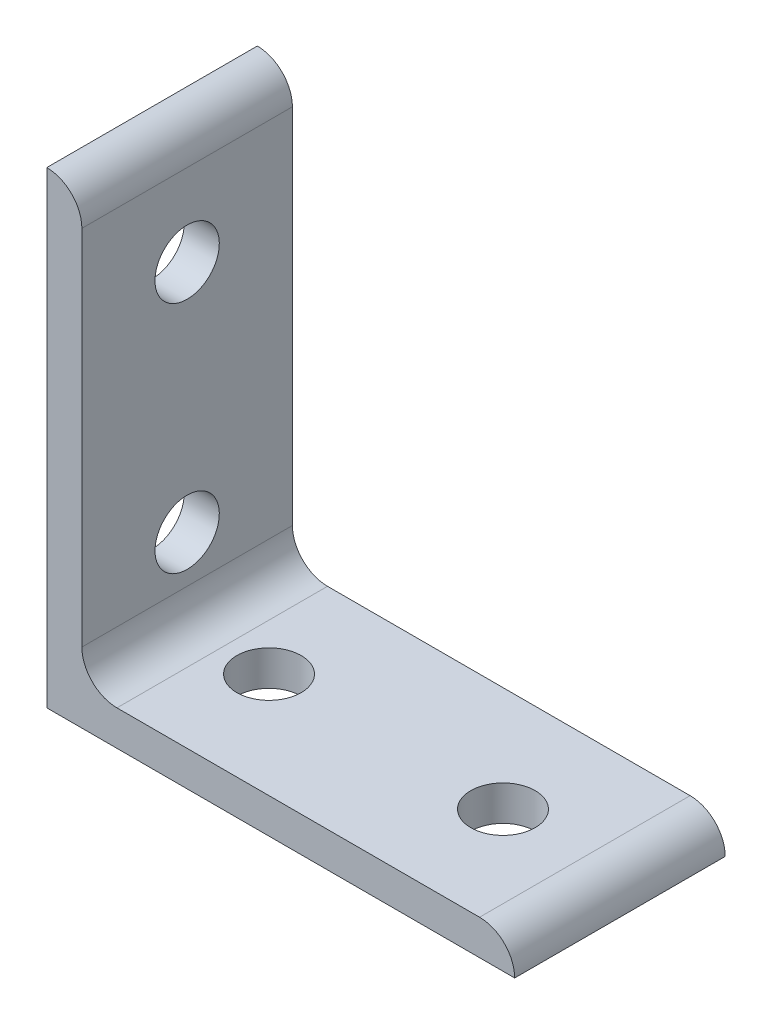
ISO-10303-21;
HEADER;
FILE_DESCRIPTION(('STEP AP214'),'2;1');
FILE_NAME('part.step','',(''),(''),'','','');
FILE_SCHEMA(('AUTOMOTIVE_DESIGN { 1 0 10303 214 1 1 1 1 }'));
ENDSEC;
DATA;
#1=APPLICATION_CONTEXT('core data for automotive mechanical design processes');
#2=APPLICATION_PROTOCOL_DEFINITION('international standard','automotive_design',2000,#1);
#3=PRODUCT_CONTEXT('',#1,'mechanical');
#4=PRODUCT('Part','Part','',(#3));
#5=PRODUCT_RELATED_PRODUCT_CATEGORY('part','',(#4));
#6=PRODUCT_DEFINITION_FORMATION('','',#4);
#7=PRODUCT_DEFINITION_CONTEXT('part definition',#1,'design');
#8=PRODUCT_DEFINITION('design','',#6,#7);
#9=PRODUCT_DEFINITION_SHAPE('','',#8);
#10=(LENGTH_UNIT() NAMED_UNIT(*) SI_UNIT(.MILLI.,.METRE.));
#11=(NAMED_UNIT(*) PLANE_ANGLE_UNIT() SI_UNIT($,.RADIAN.));
#12=(NAMED_UNIT(*) SI_UNIT($,.STERADIAN.) SOLID_ANGLE_UNIT());
#13=UNCERTAINTY_MEASURE_WITH_UNIT(LENGTH_MEASURE(1.E-05),#10,'distance_accuracy_value','');
#14=(GEOMETRIC_REPRESENTATION_CONTEXT(3) GLOBAL_UNCERTAINTY_ASSIGNED_CONTEXT((#13)) GLOBAL_UNIT_ASSIGNED_CONTEXT((#10,
#11,#12)) REPRESENTATION_CONTEXT('',''));
#15=CARTESIAN_POINT('',(0.,0.,0.));
#16=DIRECTION('',(0.,0.,1.));
#17=DIRECTION('',(1.,0.,0.));
#18=AXIS2_PLACEMENT_3D('',#15,#16,#17);
#19=CARTESIAN_POINT('',(3.,37.,9.));
#20=DIRECTION('',(-1.,0.,0.));
#21=DIRECTION('',(0.,-1.,0.));
#22=AXIS2_PLACEMENT_3D('',#19,#20,#21);
#23=PLANE('',#22);
#24=CARTESIAN_POINT('',(3.,10.,0.));
#25=DIRECTION('',(-1.,0.,0.));
#26=DIRECTION('',(0.,-1.,0.));
#27=AXIS2_PLACEMENT_3D('',#24,#25,#26);
#28=CIRCLE('',#27,2.75);
#29=CARTESIAN_POINT('',(3.,7.25000000000001,0.));
#30=VERTEX_POINT('',#29);
#31=EDGE_CURVE('E198',#30,#30,#28,.F.);
#32=ORIENTED_EDGE('',*,*,#31,.F.);
#33=EDGE_LOOP('',(#32));
#34=FACE_BOUND('',#33,.T.);
#35=DIRECTION('',(0.,1.,0.));
#36=VECTOR('',#35,1.);
#37=CARTESIAN_POINT('',(3.,37.,-9.));
#38=LINE('',#37,#36);
#39=CARTESIAN_POINT('',(3.,6.,-9.));
#40=VERTEX_POINT('',#39);
#41=CARTESIAN_POINT('',(3.,37.,-9.));
#42=VERTEX_POINT('',#41);
#43=EDGE_CURVE('E119',#40,#42,#38,.T.);
#44=ORIENTED_EDGE('',*,*,#43,.T.);
#45=DIRECTION('',(0.,0.,-1.));
#46=VECTOR('',#45,1.);
#47=CARTESIAN_POINT('',(3.,37.,9.));
#48=LINE('',#47,#46);
#49=CARTESIAN_POINT('',(3.,37.,9.));
#50=VERTEX_POINT('',#49);
#51=EDGE_CURVE('E116',#50,#42,#48,.T.);
#52=ORIENTED_EDGE('',*,*,#51,.F.);
#53=DIRECTION('',(0.,1.,0.));
#54=VECTOR('',#53,1.);
#55=CARTESIAN_POINT('',(3.,37.,9.));
#56=LINE('',#55,#54);
#57=CARTESIAN_POINT('',(3.,6.,9.));
#58=VERTEX_POINT('',#57);
#59=EDGE_CURVE('E105',#58,#50,#56,.T.);
#60=ORIENTED_EDGE('',*,*,#59,.F.);
#61=DIRECTION('',(0.,0.,-1.));
#62=VECTOR('',#61,1.);
#63=CARTESIAN_POINT('',(3.,6.,9.));
#64=LINE('',#63,#62);
#65=EDGE_CURVE('E120',#58,#40,#64,.T.);
#66=ORIENTED_EDGE('',*,*,#65,.T.);
#67=EDGE_LOOP('',(#44,#52,#60,#66));
#68=FACE_BOUND('',#67,.T.);
#69=CARTESIAN_POINT('',(3.,30.,0.));
#70=DIRECTION('',(-1.,0.,0.));
#71=DIRECTION('',(0.,-1.,0.));
#72=AXIS2_PLACEMENT_3D('',#69,#70,#71);
#73=CIRCLE('',#72,2.75);
#74=CARTESIAN_POINT('',(3.,27.25,0.));
#75=VERTEX_POINT('',#74);
#76=EDGE_CURVE('E191',#75,#75,#73,.F.);
#77=ORIENTED_EDGE('',*,*,#76,.F.);
#78=EDGE_LOOP('',(#77));
#79=FACE_BOUND('',#78,.T.);
#80=ADVANCED_FACE('F36',(#34,#68,#79),#23,.F.);
#81=CARTESIAN_POINT('',(0.,0.,9.));
#82=DIRECTION('',(1.,0.,0.));
#83=DIRECTION('',(0.,0.,-1.));
#84=AXIS2_PLACEMENT_3D('',#81,#82,#83);
#85=PLANE('',#84);
#86=CARTESIAN_POINT('',(0.,10.,0.));
#87=DIRECTION('',(1.,0.,0.));
#88=DIRECTION('',(0.,0.,-1.));
#89=AXIS2_PLACEMENT_3D('',#86,#87,#88);
#90=CIRCLE('',#89,2.75);
#91=CARTESIAN_POINT('',(0.,10.,-2.75));
#92=VERTEX_POINT('',#91);
#93=EDGE_CURVE('E194',#92,#92,#90,.T.);
#94=ORIENTED_EDGE('',*,*,#93,.T.);
#95=EDGE_LOOP('',(#94));
#96=FACE_BOUND('',#95,.T.);
#97=DIRECTION('',(0.,-1.,0.));
#98=VECTOR('',#97,1.);
#99=CARTESIAN_POINT('',(0.,0.,-9.));
#100=LINE('',#99,#98);
#101=CARTESIAN_POINT('',(0.,40.,-9.));
#102=VERTEX_POINT('',#101);
#103=CARTESIAN_POINT('',(0.,0.,-9.));
#104=VERTEX_POINT('',#103);
#105=EDGE_CURVE('E87',#102,#104,#100,.T.);
#106=ORIENTED_EDGE('',*,*,#105,.T.);
#107=DIRECTION('',(0.,0.,-1.));
#108=VECTOR('',#107,1.);
#109=CARTESIAN_POINT('',(0.,0.,9.));
#110=LINE('',#109,#108);
#111=CARTESIAN_POINT('',(0.,0.,9.));
#112=VERTEX_POINT('',#111);
#113=EDGE_CURVE('E125',#112,#104,#110,.T.);
#114=ORIENTED_EDGE('',*,*,#113,.F.);
#115=DIRECTION('',(0.,-1.,0.));
#116=VECTOR('',#115,1.);
#117=CARTESIAN_POINT('',(0.,0.,9.));
#118=LINE('',#117,#116);
#119=CARTESIAN_POINT('',(0.,40.,9.));
#120=VERTEX_POINT('',#119);
#121=EDGE_CURVE('E55',#120,#112,#118,.T.);
#122=ORIENTED_EDGE('',*,*,#121,.F.);
#123=DIRECTION('',(0.,0.,-1.));
#124=VECTOR('',#123,1.);
#125=CARTESIAN_POINT('',(0.,40.,9.));
#126=LINE('',#125,#124);
#127=EDGE_CURVE('E121',#120,#102,#126,.T.);
#128=ORIENTED_EDGE('',*,*,#127,.T.);
#129=EDGE_LOOP('',(#106,#114,#122,#128));
#130=FACE_BOUND('',#129,.T.);
#131=CARTESIAN_POINT('',(0.,30.,0.));
#132=DIRECTION('',(1.,0.,0.));
#133=DIRECTION('',(0.,0.,-1.));
#134=AXIS2_PLACEMENT_3D('',#131,#132,#133);
#135=CIRCLE('',#134,2.75);
#136=CARTESIAN_POINT('',(0.,30.,-2.75));
#137=VERTEX_POINT('',#136);
#138=EDGE_CURVE('E189',#137,#137,#135,.T.);
#139=ORIENTED_EDGE('',*,*,#138,.T.);
#140=EDGE_LOOP('',(#139));
#141=FACE_BOUND('',#140,.T.);
#142=ADVANCED_FACE('F182',(#96,#130,#141),#85,.F.);
#143=CARTESIAN_POINT('',(40.,0.,9.));
#144=DIRECTION('',(0.,1.,0.));
#145=DIRECTION('',(-1.,0.,0.));
#146=AXIS2_PLACEMENT_3D('',#143,#144,#145);
#147=PLANE('',#146);
#148=CARTESIAN_POINT('',(10.,0.,0.));
#149=DIRECTION('',(0.,1.,0.));
#150=DIRECTION('',(0.,0.,1.));
#151=AXIS2_PLACEMENT_3D('',#148,#149,#150);
#152=CIRCLE('',#151,2.75);
#153=CARTESIAN_POINT('',(10.,0.,2.75));
#154=VERTEX_POINT('',#153);
#155=EDGE_CURVE('E151',#154,#154,#152,.T.);
#156=ORIENTED_EDGE('',*,*,#155,.T.);
#157=EDGE_LOOP('',(#156));
#158=FACE_BOUND('',#157,.T.);
#159=DIRECTION('',(1.,0.,0.));
#160=VECTOR('',#159,1.);
#161=CARTESIAN_POINT('',(40.,0.,-9.));
#162=LINE('',#161,#160);
#163=CARTESIAN_POINT('',(40.,0.,-9.));
#164=VERTEX_POINT('',#163);
#165=EDGE_CURVE('E129',#104,#164,#162,.T.);
#166=ORIENTED_EDGE('',*,*,#165,.T.);
#167=DIRECTION('',(0.,0.,-1.));
#168=VECTOR('',#167,1.);
#169=CARTESIAN_POINT('',(40.,0.,9.));
#170=LINE('',#169,#168);
#171=CARTESIAN_POINT('',(40.,0.,9.));
#172=VERTEX_POINT('',#171);
#173=EDGE_CURVE('E11',#172,#164,#170,.T.);
#174=ORIENTED_EDGE('',*,*,#173,.F.);
#175=DIRECTION('',(1.,0.,0.));
#176=VECTOR('',#175,1.);
#177=CARTESIAN_POINT('',(40.,0.,9.));
#178=LINE('',#177,#176);
#179=EDGE_CURVE('E142',#112,#172,#178,.T.);
#180=ORIENTED_EDGE('',*,*,#179,.F.);
#181=ORIENTED_EDGE('',*,*,#113,.T.);
#182=EDGE_LOOP('',(#166,#174,#180,#181));
#183=FACE_BOUND('',#182,.T.);
#184=CARTESIAN_POINT('',(30.,0.,0.));
#185=DIRECTION('',(0.,1.,0.));
#186=DIRECTION('',(0.,0.,1.));
#187=AXIS2_PLACEMENT_3D('',#184,#185,#186);
#188=CIRCLE('',#187,2.74999999999999);
#189=CARTESIAN_POINT('',(30.,0.,2.74999999999999));
#190=VERTEX_POINT('',#189);
#191=EDGE_CURVE('E159',#190,#190,#188,.T.);
#192=ORIENTED_EDGE('',*,*,#191,.T.);
#193=EDGE_LOOP('',(#192));
#194=FACE_BOUND('',#193,.T.);
#195=ADVANCED_FACE('F38',(#158,#183,#194),#147,.F.);
#196=CARTESIAN_POINT('',(6.,3.,9.));
#197=DIRECTION('',(0.,-1.,0.));
#198=DIRECTION('',(1.,0.,0.));
#199=AXIS2_PLACEMENT_3D('',#196,#197,#198);
#200=PLANE('',#199);
#201=CARTESIAN_POINT('',(10.,3.,0.));
#202=DIRECTION('',(0.,-1.,0.));
#203=DIRECTION('',(1.,0.,0.));
#204=AXIS2_PLACEMENT_3D('',#201,#202,#203);
#205=CIRCLE('',#204,2.75);
#206=CARTESIAN_POINT('',(12.75,3.,0.));
#207=VERTEX_POINT('',#206);
#208=EDGE_CURVE('E133',#207,#207,#205,.F.);
#209=ORIENTED_EDGE('',*,*,#208,.F.);
#210=EDGE_LOOP('',(#209));
#211=FACE_BOUND('',#210,.T.);
#212=DIRECTION('',(-1.,0.,0.));
#213=VECTOR('',#212,1.);
#214=CARTESIAN_POINT('',(6.,3.,-9.));
#215=LINE('',#214,#213);
#216=CARTESIAN_POINT('',(37.,3.,-9.));
#217=VERTEX_POINT('',#216);
#218=CARTESIAN_POINT('',(6.,3.,-9.));
#219=VERTEX_POINT('',#218);
#220=EDGE_CURVE('E135',#217,#219,#215,.T.);
#221=ORIENTED_EDGE('',*,*,#220,.T.);
#222=DIRECTION('',(0.,0.,-1.));
#223=VECTOR('',#222,1.);
#224=CARTESIAN_POINT('',(6.,3.,9.));
#225=LINE('',#224,#223);
#226=CARTESIAN_POINT('',(6.,3.,9.));
#227=VERTEX_POINT('',#226);
#228=EDGE_CURVE('E146',#227,#219,#225,.T.);
#229=ORIENTED_EDGE('',*,*,#228,.F.);
#230=DIRECTION('',(-1.,0.,0.));
#231=VECTOR('',#230,1.);
#232=CARTESIAN_POINT('',(6.,3.,9.));
#233=LINE('',#232,#231);
#234=CARTESIAN_POINT('',(37.,3.,9.));
#235=VERTEX_POINT('',#234);
#236=EDGE_CURVE('E165',#235,#227,#233,.T.);
#237=ORIENTED_EDGE('',*,*,#236,.F.);
#238=DIRECTION('',(0.,0.,-1.));
#239=VECTOR('',#238,1.);
#240=CARTESIAN_POINT('',(37.,3.,9.));
#241=LINE('',#240,#239);
#242=EDGE_CURVE('E46',#235,#217,#241,.T.);
#243=ORIENTED_EDGE('',*,*,#242,.T.);
#244=EDGE_LOOP('',(#221,#229,#237,#243));
#245=FACE_BOUND('',#244,.T.);
#246=CARTESIAN_POINT('',(30.,3.,0.));
#247=DIRECTION('',(0.,-1.,0.));
#248=DIRECTION('',(1.,0.,0.));
#249=AXIS2_PLACEMENT_3D('',#246,#247,#248);
#250=CIRCLE('',#249,2.74999999999999);
#251=CARTESIAN_POINT('',(32.75,3.,0.));
#252=VERTEX_POINT('',#251);
#253=EDGE_CURVE('E40',#252,#252,#250,.F.);
#254=ORIENTED_EDGE('',*,*,#253,.F.);
#255=EDGE_LOOP('',(#254));
#256=FACE_BOUND('',#255,.T.);
#257=ADVANCED_FACE('F169',(#211,#245,#256),#200,.F.);
#258=CARTESIAN_POINT('',(37.,0.,9.));
#259=DIRECTION('',(0.,0.,-1.));
#260=DIRECTION('',(-1.,0.,0.));
#261=AXIS2_PLACEMENT_3D('',#258,#259,#260);
#262=CYLINDRICAL_SURFACE('',#261,3.00000000000001);
#263=CARTESIAN_POINT('',(37.,0.,-9.));
#264=DIRECTION('',(0.,0.,1.));
#265=DIRECTION('',(1.,0.,0.));
#266=AXIS2_PLACEMENT_3D('',#263,#264,#265);
#267=CIRCLE('',#266,3.00000000000001);
#268=EDGE_CURVE('E132',#164,#217,#267,.T.);
#269=ORIENTED_EDGE('',*,*,#268,.T.);
#270=ORIENTED_EDGE('',*,*,#242,.F.);
#271=CARTESIAN_POINT('',(37.,0.,9.));
#272=DIRECTION('',(0.,0.,1.));
#273=DIRECTION('',(1.,0.,0.));
#274=AXIS2_PLACEMENT_3D('',#271,#272,#273);
#275=CIRCLE('',#274,3.00000000000001);
#276=EDGE_CURVE('E95',#172,#235,#275,.T.);
#277=ORIENTED_EDGE('',*,*,#276,.F.);
#278=ORIENTED_EDGE('',*,*,#173,.T.);
#279=EDGE_LOOP('',(#269,#270,#277,#278));
#280=FACE_BOUND('',#279,.T.);
#281=ADVANCED_FACE('F213',(#280),#262,.T.);
#282=CARTESIAN_POINT('',(6.,6.,9.));
#283=DIRECTION('',(0.,0.,-1.));
#284=DIRECTION('',(-1.,0.,0.));
#285=AXIS2_PLACEMENT_3D('',#282,#283,#284);
#286=CYLINDRICAL_SURFACE('',#285,3.);
#287=CARTESIAN_POINT('',(6.,6.,-9.));
#288=DIRECTION('',(0.,0.,-1.));
#289=DIRECTION('',(1.,0.,0.));
#290=AXIS2_PLACEMENT_3D('',#287,#288,#289);
#291=CIRCLE('',#290,3.);
#292=EDGE_CURVE('E137',#219,#40,#291,.T.);
#293=ORIENTED_EDGE('',*,*,#292,.T.);
#294=ORIENTED_EDGE('',*,*,#65,.F.);
#295=CARTESIAN_POINT('',(6.,6.,9.));
#296=DIRECTION('',(0.,0.,-1.));
#297=DIRECTION('',(1.,0.,0.));
#298=AXIS2_PLACEMENT_3D('',#295,#296,#297);
#299=CIRCLE('',#298,3.);
#300=EDGE_CURVE('E111',#227,#58,#299,.T.);
#301=ORIENTED_EDGE('',*,*,#300,.F.);
#302=ORIENTED_EDGE('',*,*,#228,.T.);
#303=EDGE_LOOP('',(#293,#294,#301,#302));
#304=FACE_BOUND('',#303,.T.);
#305=ADVANCED_FACE('F174',(#304),#286,.F.);
#306=CARTESIAN_POINT('',(0.,37.,9.));
#307=DIRECTION('',(0.,0.,-1.));
#308=DIRECTION('',(-1.,0.,0.));
#309=AXIS2_PLACEMENT_3D('',#306,#307,#308);
#310=CYLINDRICAL_SURFACE('',#309,3.00000000000001);
#311=CARTESIAN_POINT('',(0.,37.,-9.));
#312=DIRECTION('',(0.,0.,1.));
#313=DIRECTION('',(1.,0.,0.));
#314=AXIS2_PLACEMENT_3D('',#311,#312,#313);
#315=CIRCLE('',#314,3.00000000000001);
#316=EDGE_CURVE('E81',#42,#102,#315,.T.);
#317=ORIENTED_EDGE('',*,*,#316,.T.);
#318=ORIENTED_EDGE('',*,*,#127,.F.);
#319=CARTESIAN_POINT('',(0.,37.,9.));
#320=DIRECTION('',(0.,0.,1.));
#321=DIRECTION('',(1.,0.,0.));
#322=AXIS2_PLACEMENT_3D('',#319,#320,#321);
#323=CIRCLE('',#322,3.00000000000001);
#324=EDGE_CURVE('E109',#50,#120,#323,.T.);
#325=ORIENTED_EDGE('',*,*,#324,.F.);
#326=ORIENTED_EDGE('',*,*,#51,.T.);
#327=EDGE_LOOP('',(#317,#318,#325,#326));
#328=FACE_BOUND('',#327,.T.);
#329=ADVANCED_FACE('F123',(#328),#310,.T.);
#330=CARTESIAN_POINT('',(0.,37.,9.));
#331=DIRECTION('',(0.,0.,1.));
#332=DIRECTION('',(1.,0.,0.));
#333=AXIS2_PLACEMENT_3D('',#330,#331,#332);
#334=PLANE('',#333);
#335=ORIENTED_EDGE('',*,*,#179,.T.);
#336=ORIENTED_EDGE('',*,*,#276,.T.);
#337=ORIENTED_EDGE('',*,*,#236,.T.);
#338=ORIENTED_EDGE('',*,*,#300,.T.);
#339=ORIENTED_EDGE('',*,*,#59,.T.);
#340=ORIENTED_EDGE('',*,*,#324,.T.);
#341=ORIENTED_EDGE('',*,*,#121,.T.);
#342=EDGE_LOOP('',(#335,#336,#337,#338,#339,#340,#341));
#343=FACE_BOUND('',#342,.T.);
#344=ADVANCED_FACE('F107',(#343),#334,.T.);
#345=CARTESIAN_POINT('',(0.,37.,-9.));
#346=DIRECTION('',(0.,0.,1.));
#347=DIRECTION('',(1.,0.,0.));
#348=AXIS2_PLACEMENT_3D('',#345,#346,#347);
#349=PLANE('',#348);
#350=ORIENTED_EDGE('',*,*,#165,.F.);
#351=ORIENTED_EDGE('',*,*,#105,.F.);
#352=ORIENTED_EDGE('',*,*,#316,.F.);
#353=ORIENTED_EDGE('',*,*,#43,.F.);
#354=ORIENTED_EDGE('',*,*,#292,.F.);
#355=ORIENTED_EDGE('',*,*,#220,.F.);
#356=ORIENTED_EDGE('',*,*,#268,.F.);
#357=EDGE_LOOP('',(#350,#351,#352,#353,#354,#355,#356));
#358=FACE_BOUND('',#357,.T.);
#359=ADVANCED_FACE('F177',(#358),#349,.F.);
#360=CARTESIAN_POINT('',(10.,40.,0.));
#361=DIRECTION('',(0.,-1.,0.));
#362=DIRECTION('',(0.,0.,-1.));
#363=AXIS2_PLACEMENT_3D('',#360,#361,#362);
#364=CYLINDRICAL_SURFACE('',#363,2.75);
#365=ORIENTED_EDGE('',*,*,#155,.F.);
#366=EDGE_LOOP('',(#365));
#367=FACE_BOUND('',#366,.T.);
#368=ORIENTED_EDGE('',*,*,#208,.T.);
#369=EDGE_LOOP('',(#368));
#370=FACE_BOUND('',#369,.T.);
#371=ADVANCED_FACE('F209',(#367,#370),#364,.F.);
#372=CARTESIAN_POINT('',(30.,40.,0.));
#373=DIRECTION('',(0.,-1.,0.));
#374=DIRECTION('',(0.,0.,-1.));
#375=AXIS2_PLACEMENT_3D('',#372,#373,#374);
#376=CYLINDRICAL_SURFACE('',#375,2.74999999999999);
#377=ORIENTED_EDGE('',*,*,#191,.F.);
#378=EDGE_LOOP('',(#377));
#379=FACE_BOUND('',#378,.T.);
#380=ORIENTED_EDGE('',*,*,#253,.T.);
#381=EDGE_LOOP('',(#380));
#382=FACE_BOUND('',#381,.T.);
#383=ADVANCED_FACE('F205',(#379,#382),#376,.F.);
#384=CARTESIAN_POINT('',(40.,10.,0.));
#385=DIRECTION('',(-1.,0.,0.));
#386=DIRECTION('',(0.,0.,1.));
#387=AXIS2_PLACEMENT_3D('',#384,#385,#386);
#388=CYLINDRICAL_SURFACE('',#387,2.75);
#389=ORIENTED_EDGE('',*,*,#93,.F.);
#390=EDGE_LOOP('',(#389));
#391=FACE_BOUND('',#390,.T.);
#392=ORIENTED_EDGE('',*,*,#31,.T.);
#393=EDGE_LOOP('',(#392));
#394=FACE_BOUND('',#393,.T.);
#395=ADVANCED_FACE('F208',(#391,#394),#388,.F.);
#396=CARTESIAN_POINT('',(40.,30.,0.));
#397=DIRECTION('',(-1.,0.,0.));
#398=DIRECTION('',(0.,0.,1.));
#399=AXIS2_PLACEMENT_3D('',#396,#397,#398);
#400=CYLINDRICAL_SURFACE('',#399,2.75);
#401=ORIENTED_EDGE('',*,*,#138,.F.);
#402=EDGE_LOOP('',(#401));
#403=FACE_BOUND('',#402,.T.);
#404=ORIENTED_EDGE('',*,*,#76,.T.);
#405=EDGE_LOOP('',(#404));
#406=FACE_BOUND('',#405,.T.);
#407=ADVANCED_FACE('F245',(#403,#406),#400,.F.);
#408=CLOSED_SHELL('',(#80,#142,#195,#257,#281,#305,#329,#344,#359,#371,#383,#395,#407));
#409=MANIFOLD_SOLID_BREP('B2',#408);
#410=ADVANCED_BREP_SHAPE_REPRESENTATION('',(#18,#409),#14);
#411=SHAPE_DEFINITION_REPRESENTATION(#9,#410);
ENDSEC;
END-ISO-10303-21;
